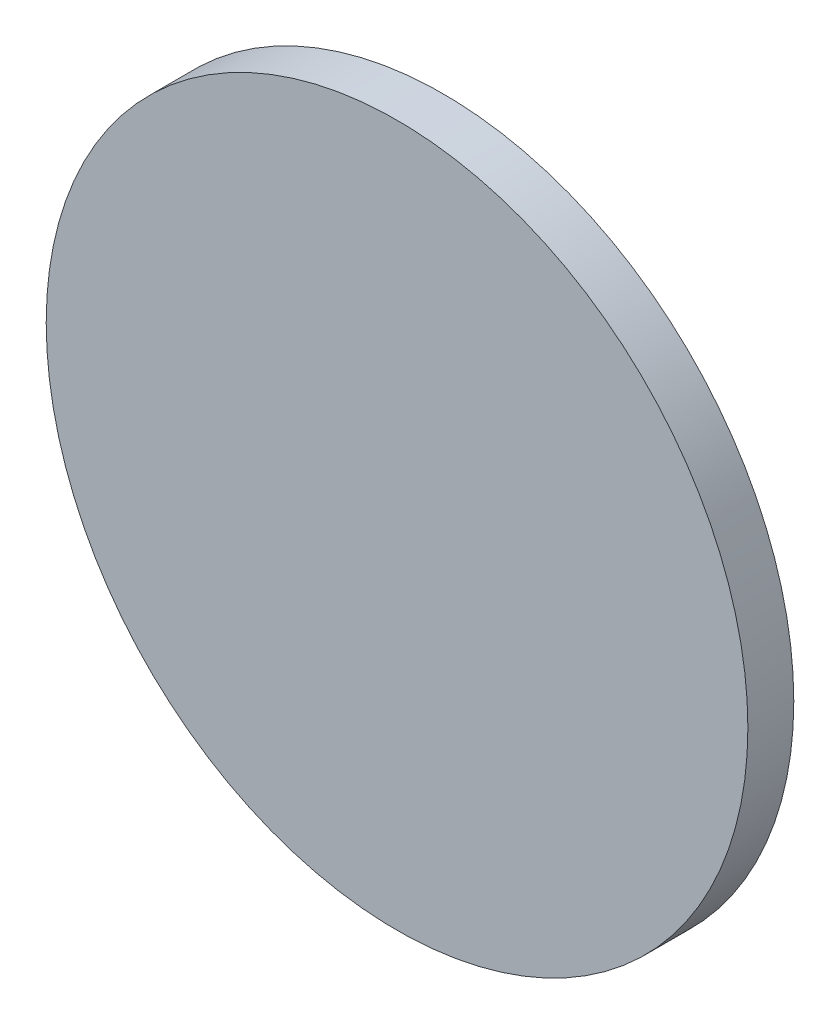
ISO-10303-21;
HEADER;
FILE_DESCRIPTION(('STEP AP214'),'2;1');
FILE_NAME('part.step','',(''),(''),'','','');
FILE_SCHEMA(('AUTOMOTIVE_DESIGN { 1 0 10303 214 1 1 1 1 }'));
ENDSEC;
DATA;
#1=APPLICATION_CONTEXT('core data for automotive mechanical design processes');
#2=APPLICATION_PROTOCOL_DEFINITION('international standard','automotive_design',2000,#1);
#3=PRODUCT_CONTEXT('',#1,'mechanical');
#4=PRODUCT('Part','Part','',(#3));
#5=PRODUCT_RELATED_PRODUCT_CATEGORY('part','',(#4));
#6=PRODUCT_DEFINITION_FORMATION('','',#4);
#7=PRODUCT_DEFINITION_CONTEXT('part definition',#1,'design');
#8=PRODUCT_DEFINITION('design','',#6,#7);
#9=PRODUCT_DEFINITION_SHAPE('','',#8);
#10=(LENGTH_UNIT() NAMED_UNIT(*) SI_UNIT(.MILLI.,.METRE.));
#11=(NAMED_UNIT(*) PLANE_ANGLE_UNIT() SI_UNIT($,.RADIAN.));
#12=(NAMED_UNIT(*) SI_UNIT($,.STERADIAN.) SOLID_ANGLE_UNIT());
#13=UNCERTAINTY_MEASURE_WITH_UNIT(LENGTH_MEASURE(1.E-05),#10,'distance_accuracy_value','');
#14=(GEOMETRIC_REPRESENTATION_CONTEXT(3) GLOBAL_UNCERTAINTY_ASSIGNED_CONTEXT((#13)) GLOBAL_UNIT_ASSIGNED_CONTEXT((#10,
#11,#12)) REPRESENTATION_CONTEXT('',''));
#15=CARTESIAN_POINT('',(0.,0.,0.));
#16=DIRECTION('',(0.,0.,1.));
#17=DIRECTION('',(1.,0.,0.));
#18=AXIS2_PLACEMENT_3D('',#15,#16,#17);
#19=CARTESIAN_POINT('',(0.,0.,10.));
#20=DIRECTION('',(0.,0.,-1.));
#21=DIRECTION('',(-1.,0.,0.));
#22=AXIS2_PLACEMENT_3D('',#19,#20,#21);
#23=CYLINDRICAL_SURFACE('',#22,76.3970157825183);
#24=CARTESIAN_POINT('',(0.,0.,10.));
#25=DIRECTION('',(0.,0.,1.));
#26=DIRECTION('',(1.,0.,0.));
#27=AXIS2_PLACEMENT_3D('',#24,#25,#26);
#28=CIRCLE('',#27,76.3970157825183);
#29=CARTESIAN_POINT('',(76.3970157825183,0.,10.));
#30=VERTEX_POINT('',#29);
#31=EDGE_CURVE('E10',#30,#30,#28,.T.);
#32=ORIENTED_EDGE('',*,*,#31,.F.);
#33=EDGE_LOOP('',(#32));
#34=FACE_BOUND('',#33,.T.);
#35=CARTESIAN_POINT('',(0.,0.,0.));
#36=DIRECTION('',(0.,0.,1.));
#37=DIRECTION('',(1.,0.,0.));
#38=AXIS2_PLACEMENT_3D('',#35,#36,#37);
#39=CIRCLE('',#38,76.3970157825183);
#40=CARTESIAN_POINT('',(76.3970157825183,0.,0.));
#41=VERTEX_POINT('',#40);
#42=EDGE_CURVE('E34',#41,#41,#39,.T.);
#43=ORIENTED_EDGE('',*,*,#42,.T.);
#44=EDGE_LOOP('',(#43));
#45=FACE_BOUND('',#44,.T.);
#46=ADVANCED_FACE('F31',(#34,#45),#23,.T.);
#47=CARTESIAN_POINT('',(0.,0.,10.));
#48=DIRECTION('',(0.,0.,1.));
#49=DIRECTION('',(1.,0.,0.));
#50=AXIS2_PLACEMENT_3D('',#47,#48,#49);
#51=PLANE('',#50);
#52=ORIENTED_EDGE('',*,*,#31,.T.);
#53=EDGE_LOOP('',(#52));
#54=FACE_BOUND('',#53,.T.);
#55=ADVANCED_FACE('F46',(#54),#51,.T.);
#56=CARTESIAN_POINT('',(0.,0.,0.));
#57=DIRECTION('',(0.,0.,1.));
#58=DIRECTION('',(1.,0.,0.));
#59=AXIS2_PLACEMENT_3D('',#56,#57,#58);
#60=PLANE('',#59);
#61=ORIENTED_EDGE('',*,*,#42,.F.);
#62=EDGE_LOOP('',(#61));
#63=FACE_BOUND('',#62,.T.);
#64=ADVANCED_FACE('F44',(#63),#60,.F.);
#65=CLOSED_SHELL('',(#46,#55,#64));
#66=MANIFOLD_SOLID_BREP('B2',#65);
#67=ADVANCED_BREP_SHAPE_REPRESENTATION('',(#18,#66),#14);
#68=SHAPE_DEFINITION_REPRESENTATION(#9,#67);
ENDSEC;
END-ISO-10303-21;
